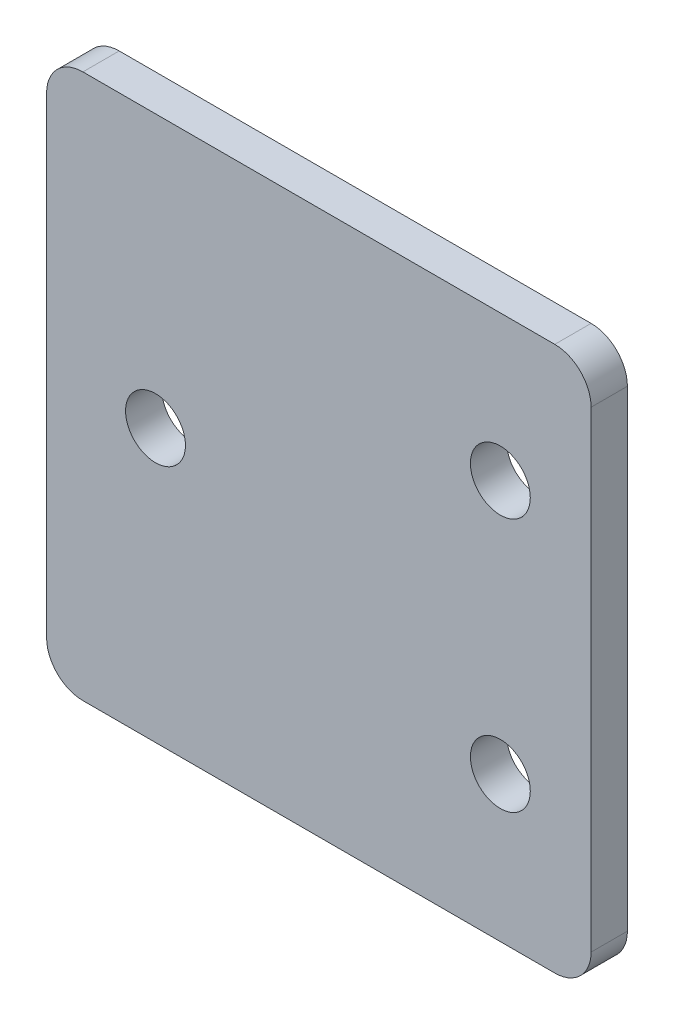
ISO-10303-21;
HEADER;
FILE_DESCRIPTION(('STEP AP214'),'2;1');
FILE_NAME('part.step','',(''),(''),'','','');
FILE_SCHEMA(('AUTOMOTIVE_DESIGN { 1 0 10303 214 1 1 1 1 }'));
ENDSEC;
DATA;
#1=APPLICATION_CONTEXT('core data for automotive mechanical design processes');
#2=APPLICATION_PROTOCOL_DEFINITION('international standard','automotive_design',2000,#1);
#3=PRODUCT_CONTEXT('',#1,'mechanical');
#4=PRODUCT('Part','Part','',(#3));
#5=PRODUCT_RELATED_PRODUCT_CATEGORY('part','',(#4));
#6=PRODUCT_DEFINITION_FORMATION('','',#4);
#7=PRODUCT_DEFINITION_CONTEXT('part definition',#1,'design');
#8=PRODUCT_DEFINITION('design','',#6,#7);
#9=PRODUCT_DEFINITION_SHAPE('','',#8);
#10=(LENGTH_UNIT() NAMED_UNIT(*) SI_UNIT(.MILLI.,.METRE.));
#11=(NAMED_UNIT(*) PLANE_ANGLE_UNIT() SI_UNIT($,.RADIAN.));
#12=(NAMED_UNIT(*) SI_UNIT($,.STERADIAN.) SOLID_ANGLE_UNIT());
#13=UNCERTAINTY_MEASURE_WITH_UNIT(LENGTH_MEASURE(1.E-05),#10,'distance_accuracy_value','');
#14=(GEOMETRIC_REPRESENTATION_CONTEXT(3) GLOBAL_UNCERTAINTY_ASSIGNED_CONTEXT((#13)) GLOBAL_UNIT_ASSIGNED_CONTEXT((#10,
#11,#12)) REPRESENTATION_CONTEXT('',''));
#15=CARTESIAN_POINT('',(0.,0.,0.));
#16=DIRECTION('',(0.,0.,1.));
#17=DIRECTION('',(1.,0.,0.));
#18=AXIS2_PLACEMENT_3D('',#15,#16,#17);
#19=CARTESIAN_POINT('',(0.,0.,0.));
#20=DIRECTION('',(0.,0.,-1.));
#21=DIRECTION('',(-1.,0.,0.));
#22=AXIS2_PLACEMENT_3D('',#19,#20,#21);
#23=PLANE('',#22);
#24=CARTESIAN_POINT('',(-9.,0.,0.));
#25=DIRECTION('',(0.,0.,1.));
#26=DIRECTION('',(1.,0.,0.));
#27=AXIS2_PLACEMENT_3D('',#24,#25,#26);
#28=CIRCLE('',#27,1.65);
#29=CARTESIAN_POINT('',(-7.35,0.,0.));
#30=VERTEX_POINT('',#29);
#31=EDGE_CURVE('E186',#30,#30,#28,.T.);
#32=ORIENTED_EDGE('',*,*,#31,.T.);
#33=EDGE_LOOP('',(#32));
#34=FACE_BOUND('',#33,.T.);
#35=CARTESIAN_POINT('',(10.,7.,0.));
#36=DIRECTION('',(0.,0.,1.));
#37=DIRECTION('',(1.,0.,0.));
#38=AXIS2_PLACEMENT_3D('',#35,#36,#37);
#39=CIRCLE('',#38,1.65);
#40=CARTESIAN_POINT('',(11.65,7.,0.));
#41=VERTEX_POINT('',#40);
#42=EDGE_CURVE('E180',#41,#41,#39,.T.);
#43=ORIENTED_EDGE('',*,*,#42,.T.);
#44=EDGE_LOOP('',(#43));
#45=FACE_BOUND('',#44,.T.);
#46=DIRECTION('',(0.,1.,0.));
#47=VECTOR('',#46,1.);
#48=CARTESIAN_POINT('',(15.,-15.,0.));
#49=LINE('',#48,#47);
#50=CARTESIAN_POINT('',(15.,-13.,0.));
#51=VERTEX_POINT('',#50);
#52=CARTESIAN_POINT('',(15.,13.,0.));
#53=VERTEX_POINT('',#52);
#54=EDGE_CURVE('E116',#51,#53,#49,.T.);
#55=ORIENTED_EDGE('',*,*,#54,.F.);
#56=CARTESIAN_POINT('',(13.,-13.,0.));
#57=DIRECTION('',(0.,0.,-1.));
#58=DIRECTION('',(-1.,0.,0.));
#59=AXIS2_PLACEMENT_3D('',#56,#57,#58);
#60=CIRCLE('',#59,2.);
#61=CARTESIAN_POINT('',(13.,-15.,0.));
#62=VERTEX_POINT('',#61);
#63=EDGE_CURVE('E99',#51,#62,#60,.T.);
#64=ORIENTED_EDGE('',*,*,#63,.T.);
#65=DIRECTION('',(1.,0.,0.));
#66=VECTOR('',#65,1.);
#67=CARTESIAN_POINT('',(-15.,-15.,0.));
#68=LINE('',#67,#66);
#69=CARTESIAN_POINT('',(-13.,-15.,0.));
#70=VERTEX_POINT('',#69);
#71=EDGE_CURVE('E139',#70,#62,#68,.T.);
#72=ORIENTED_EDGE('',*,*,#71,.F.);
#73=CARTESIAN_POINT('',(-13.,-13.,0.));
#74=DIRECTION('',(0.,0.,-1.));
#75=DIRECTION('',(-1.,0.,0.));
#76=AXIS2_PLACEMENT_3D('',#73,#74,#75);
#77=CIRCLE('',#76,2.);
#78=CARTESIAN_POINT('',(-15.,-13.,0.));
#79=VERTEX_POINT('',#78);
#80=EDGE_CURVE('E143',#70,#79,#77,.T.);
#81=ORIENTED_EDGE('',*,*,#80,.T.);
#82=DIRECTION('',(0.,-1.,0.));
#83=VECTOR('',#82,1.);
#84=CARTESIAN_POINT('',(-15.,-15.,0.));
#85=LINE('',#84,#83);
#86=CARTESIAN_POINT('',(-15.,13.,0.));
#87=VERTEX_POINT('',#86);
#88=EDGE_CURVE('E129',#87,#79,#85,.T.);
#89=ORIENTED_EDGE('',*,*,#88,.F.);
#90=CARTESIAN_POINT('',(-13.,13.,0.));
#91=DIRECTION('',(0.,0.,-1.));
#92=DIRECTION('',(-1.,0.,0.));
#93=AXIS2_PLACEMENT_3D('',#90,#91,#92);
#94=CIRCLE('',#93,2.);
#95=CARTESIAN_POINT('',(-13.,15.,0.));
#96=VERTEX_POINT('',#95);
#97=EDGE_CURVE('E120',#87,#96,#94,.T.);
#98=ORIENTED_EDGE('',*,*,#97,.T.);
#99=DIRECTION('',(-1.,0.,0.));
#100=VECTOR('',#99,1.);
#101=CARTESIAN_POINT('',(-15.,15.,0.));
#102=LINE('',#101,#100);
#103=CARTESIAN_POINT('',(13.,15.,0.));
#104=VERTEX_POINT('',#103);
#105=EDGE_CURVE('E125',#104,#96,#102,.T.);
#106=ORIENTED_EDGE('',*,*,#105,.F.);
#107=CARTESIAN_POINT('',(13.,13.,0.));
#108=DIRECTION('',(0.,0.,-1.));
#109=DIRECTION('',(-1.,0.,0.));
#110=AXIS2_PLACEMENT_3D('',#107,#108,#109);
#111=CIRCLE('',#110,2.);
#112=EDGE_CURVE('E110',#104,#53,#111,.T.);
#113=ORIENTED_EDGE('',*,*,#112,.T.);
#114=EDGE_LOOP('',(#55,#64,#72,#81,#89,#98,#106,#113));
#115=FACE_BOUND('',#114,.T.);
#116=CARTESIAN_POINT('',(10.,-7.,0.));
#117=DIRECTION('',(0.,0.,1.));
#118=DIRECTION('',(1.,0.,0.));
#119=AXIS2_PLACEMENT_3D('',#116,#117,#118);
#120=CIRCLE('',#119,1.65);
#121=CARTESIAN_POINT('',(11.65,-7.,0.));
#122=VERTEX_POINT('',#121);
#123=EDGE_CURVE('E126',#122,#122,#120,.T.);
#124=ORIENTED_EDGE('',*,*,#123,.T.);
#125=EDGE_LOOP('',(#124));
#126=FACE_BOUND('',#125,.T.);
#127=ADVANCED_FACE('F34',(#34,#45,#115,#126),#23,.T.);
#128=CARTESIAN_POINT('',(15.,-15.,2.));
#129=DIRECTION('',(-1.,0.,0.));
#130=DIRECTION('',(0.,0.,1.));
#131=AXIS2_PLACEMENT_3D('',#128,#129,#130);
#132=PLANE('',#131);
#133=DIRECTION('',(0.,1.,0.));
#134=VECTOR('',#133,1.);
#135=CARTESIAN_POINT('',(15.,-15.,2.));
#136=LINE('',#135,#134);
#137=CARTESIAN_POINT('',(15.,-13.,2.));
#138=VERTEX_POINT('',#137);
#139=CARTESIAN_POINT('',(15.,13.,2.));
#140=VERTEX_POINT('',#139);
#141=EDGE_CURVE('E119',#138,#140,#136,.T.);
#142=ORIENTED_EDGE('',*,*,#141,.F.);
#143=DIRECTION('',(0.,0.,-1.));
#144=VECTOR('',#143,1.);
#145=CARTESIAN_POINT('',(15.,-13.,2.));
#146=LINE('',#145,#144);
#147=EDGE_CURVE('E103',#138,#51,#146,.T.);
#148=ORIENTED_EDGE('',*,*,#147,.T.);
#149=ORIENTED_EDGE('',*,*,#54,.T.);
#150=DIRECTION('',(0.,0.,-1.));
#151=VECTOR('',#150,1.);
#152=CARTESIAN_POINT('',(15.,13.,2.));
#153=LINE('',#152,#151);
#154=EDGE_CURVE('E121',#53,#140,#153,.F.);
#155=ORIENTED_EDGE('',*,*,#154,.T.);
#156=EDGE_LOOP('',(#142,#148,#149,#155));
#157=FACE_BOUND('',#156,.T.);
#158=ADVANCED_FACE('F115',(#157),#132,.F.);
#159=CARTESIAN_POINT('',(-15.,15.,2.));
#160=DIRECTION('',(0.,-1.,0.));
#161=DIRECTION('',(0.,0.,-1.));
#162=AXIS2_PLACEMENT_3D('',#159,#160,#161);
#163=PLANE('',#162);
#164=DIRECTION('',(-1.,0.,0.));
#165=VECTOR('',#164,1.);
#166=CARTESIAN_POINT('',(-15.,15.,2.));
#167=LINE('',#166,#165);
#168=CARTESIAN_POINT('',(13.,15.,2.));
#169=VERTEX_POINT('',#168);
#170=CARTESIAN_POINT('',(-13.,15.,2.));
#171=VERTEX_POINT('',#170);
#172=EDGE_CURVE('E174',#169,#171,#167,.T.);
#173=ORIENTED_EDGE('',*,*,#172,.F.);
#174=DIRECTION('',(0.,0.,-1.));
#175=VECTOR('',#174,1.);
#176=CARTESIAN_POINT('',(13.,15.,2.));
#177=LINE('',#176,#175);
#178=EDGE_CURVE('E158',#169,#104,#177,.T.);
#179=ORIENTED_EDGE('',*,*,#178,.T.);
#180=ORIENTED_EDGE('',*,*,#105,.T.);
#181=DIRECTION('',(0.,0.,-1.));
#182=VECTOR('',#181,1.);
#183=CARTESIAN_POINT('',(-13.,15.,2.));
#184=LINE('',#183,#182);
#185=EDGE_CURVE('E156',#96,#171,#184,.F.);
#186=ORIENTED_EDGE('',*,*,#185,.T.);
#187=EDGE_LOOP('',(#173,#179,#180,#186));
#188=FACE_BOUND('',#187,.T.);
#189=ADVANCED_FACE('F221',(#188),#163,.F.);
#190=CARTESIAN_POINT('',(-15.,-15.,2.));
#191=DIRECTION('',(1.,0.,0.));
#192=DIRECTION('',(0.,0.,-1.));
#193=AXIS2_PLACEMENT_3D('',#190,#191,#192);
#194=PLANE('',#193);
#195=ORIENTED_EDGE('',*,*,#88,.T.);
#196=DIRECTION('',(0.,0.,-1.));
#197=VECTOR('',#196,1.);
#198=CARTESIAN_POINT('',(-15.,-13.,2.));
#199=LINE('',#198,#197);
#200=CARTESIAN_POINT('',(-15.,-13.,2.));
#201=VERTEX_POINT('',#200);
#202=EDGE_CURVE('E11',#79,#201,#199,.F.);
#203=ORIENTED_EDGE('',*,*,#202,.T.);
#204=DIRECTION('',(0.,-1.,0.));
#205=VECTOR('',#204,1.);
#206=CARTESIAN_POINT('',(-15.,-15.,2.));
#207=LINE('',#206,#205);
#208=CARTESIAN_POINT('',(-15.,13.,2.));
#209=VERTEX_POINT('',#208);
#210=EDGE_CURVE('E164',#209,#201,#207,.T.);
#211=ORIENTED_EDGE('',*,*,#210,.F.);
#212=DIRECTION('',(0.,0.,-1.));
#213=VECTOR('',#212,1.);
#214=CARTESIAN_POINT('',(-15.,13.,2.));
#215=LINE('',#214,#213);
#216=EDGE_CURVE('E42',#209,#87,#215,.T.);
#217=ORIENTED_EDGE('',*,*,#216,.T.);
#218=EDGE_LOOP('',(#195,#203,#211,#217));
#219=FACE_BOUND('',#218,.T.);
#220=ADVANCED_FACE('F163',(#219),#194,.F.);
#221=CARTESIAN_POINT('',(-15.,-15.,2.));
#222=DIRECTION('',(0.,1.,0.));
#223=DIRECTION('',(0.,0.,1.));
#224=AXIS2_PLACEMENT_3D('',#221,#222,#223);
#225=PLANE('',#224);
#226=ORIENTED_EDGE('',*,*,#71,.T.);
#227=DIRECTION('',(0.,0.,-1.));
#228=VECTOR('',#227,1.);
#229=CARTESIAN_POINT('',(13.,-15.,2.));
#230=LINE('',#229,#228);
#231=CARTESIAN_POINT('',(13.,-15.,2.));
#232=VERTEX_POINT('',#231);
#233=EDGE_CURVE('E104',#62,#232,#230,.F.);
#234=ORIENTED_EDGE('',*,*,#233,.T.);
#235=DIRECTION('',(1.,0.,0.));
#236=VECTOR('',#235,1.);
#237=CARTESIAN_POINT('',(-15.,-15.,2.));
#238=LINE('',#237,#236);
#239=CARTESIAN_POINT('',(-13.,-15.,2.));
#240=VERTEX_POINT('',#239);
#241=EDGE_CURVE('E135',#240,#232,#238,.T.);
#242=ORIENTED_EDGE('',*,*,#241,.F.);
#243=DIRECTION('',(0.,0.,-1.));
#244=VECTOR('',#243,1.);
#245=CARTESIAN_POINT('',(-13.,-15.,2.));
#246=LINE('',#245,#244);
#247=EDGE_CURVE('E109',#240,#70,#246,.T.);
#248=ORIENTED_EDGE('',*,*,#247,.T.);
#249=EDGE_LOOP('',(#226,#234,#242,#248));
#250=FACE_BOUND('',#249,.T.);
#251=ADVANCED_FACE('F172',(#250),#225,.F.);
#252=CARTESIAN_POINT('',(0.,0.,2.));
#253=DIRECTION('',(0.,0.,-1.));
#254=DIRECTION('',(-1.,0.,0.));
#255=AXIS2_PLACEMENT_3D('',#252,#253,#254);
#256=PLANE('',#255);
#257=CARTESIAN_POINT('',(-9.,0.,2.));
#258=DIRECTION('',(0.,0.,1.));
#259=DIRECTION('',(1.,0.,0.));
#260=AXIS2_PLACEMENT_3D('',#257,#258,#259);
#261=CIRCLE('',#260,1.65);
#262=CARTESIAN_POINT('',(-7.35,0.,2.));
#263=VERTEX_POINT('',#262);
#264=EDGE_CURVE('E189',#263,#263,#261,.T.);
#265=ORIENTED_EDGE('',*,*,#264,.F.);
#266=EDGE_LOOP('',(#265));
#267=FACE_BOUND('',#266,.T.);
#268=CARTESIAN_POINT('',(10.,7.,2.));
#269=DIRECTION('',(0.,0.,1.));
#270=DIRECTION('',(1.,0.,0.));
#271=AXIS2_PLACEMENT_3D('',#268,#269,#270);
#272=CIRCLE('',#271,1.65);
#273=CARTESIAN_POINT('',(11.65,7.,2.));
#274=VERTEX_POINT('',#273);
#275=EDGE_CURVE('E183',#274,#274,#272,.T.);
#276=ORIENTED_EDGE('',*,*,#275,.F.);
#277=EDGE_LOOP('',(#276));
#278=FACE_BOUND('',#277,.T.);
#279=CARTESIAN_POINT('',(10.,-7.,2.));
#280=DIRECTION('',(0.,0.,1.));
#281=DIRECTION('',(1.,0.,0.));
#282=AXIS2_PLACEMENT_3D('',#279,#280,#281);
#283=CIRCLE('',#282,1.65);
#284=CARTESIAN_POINT('',(11.65,-7.,2.));
#285=VERTEX_POINT('',#284);
#286=EDGE_CURVE('E132',#285,#285,#283,.T.);
#287=ORIENTED_EDGE('',*,*,#286,.F.);
#288=EDGE_LOOP('',(#287));
#289=FACE_BOUND('',#288,.T.);
#290=ORIENTED_EDGE('',*,*,#241,.T.);
#291=CARTESIAN_POINT('',(13.,-13.,2.));
#292=DIRECTION('',(0.,0.,-1.));
#293=DIRECTION('',(-1.,0.,0.));
#294=AXIS2_PLACEMENT_3D('',#291,#292,#293);
#295=CIRCLE('',#294,2.);
#296=EDGE_CURVE('E154',#232,#138,#295,.F.);
#297=ORIENTED_EDGE('',*,*,#296,.T.);
#298=ORIENTED_EDGE('',*,*,#141,.T.);
#299=CARTESIAN_POINT('',(13.,13.,2.));
#300=DIRECTION('',(0.,0.,-1.));
#301=DIRECTION('',(-1.,0.,0.));
#302=AXIS2_PLACEMENT_3D('',#299,#300,#301);
#303=CIRCLE('',#302,2.);
#304=EDGE_CURVE('E152',#140,#169,#303,.F.);
#305=ORIENTED_EDGE('',*,*,#304,.T.);
#306=ORIENTED_EDGE('',*,*,#172,.T.);
#307=CARTESIAN_POINT('',(-13.,13.,2.));
#308=DIRECTION('',(0.,0.,-1.));
#309=DIRECTION('',(-1.,0.,0.));
#310=AXIS2_PLACEMENT_3D('',#307,#308,#309);
#311=CIRCLE('',#310,2.);
#312=EDGE_CURVE('E54',#171,#209,#311,.F.);
#313=ORIENTED_EDGE('',*,*,#312,.T.);
#314=ORIENTED_EDGE('',*,*,#210,.T.);
#315=CARTESIAN_POINT('',(-13.,-13.,2.));
#316=DIRECTION('',(0.,0.,-1.));
#317=DIRECTION('',(-1.,0.,0.));
#318=AXIS2_PLACEMENT_3D('',#315,#316,#317);
#319=CIRCLE('',#318,2.);
#320=EDGE_CURVE('E150',#201,#240,#319,.F.);
#321=ORIENTED_EDGE('',*,*,#320,.T.);
#322=EDGE_LOOP('',(#290,#297,#298,#305,#306,#313,#314,#321));
#323=FACE_BOUND('',#322,.T.);
#324=ADVANCED_FACE('F195',(#267,#278,#289,#323),#256,.F.);
#325=CARTESIAN_POINT('',(13.,-13.,2.));
#326=DIRECTION('',(0.,0.,-1.));
#327=DIRECTION('',(-1.,0.,0.));
#328=AXIS2_PLACEMENT_3D('',#325,#326,#327);
#329=CYLINDRICAL_SURFACE('',#328,2.);
#330=ORIENTED_EDGE('',*,*,#296,.F.);
#331=ORIENTED_EDGE('',*,*,#233,.F.);
#332=ORIENTED_EDGE('',*,*,#63,.F.);
#333=ORIENTED_EDGE('',*,*,#147,.F.);
#334=EDGE_LOOP('',(#330,#331,#332,#333));
#335=FACE_BOUND('',#334,.T.);
#336=ADVANCED_FACE('F102',(#335),#329,.T.);
#337=CARTESIAN_POINT('',(13.,13.,2.));
#338=DIRECTION('',(0.,0.,-1.));
#339=DIRECTION('',(-1.,0.,0.));
#340=AXIS2_PLACEMENT_3D('',#337,#338,#339);
#341=CYLINDRICAL_SURFACE('',#340,2.);
#342=ORIENTED_EDGE('',*,*,#304,.F.);
#343=ORIENTED_EDGE('',*,*,#154,.F.);
#344=ORIENTED_EDGE('',*,*,#112,.F.);
#345=ORIENTED_EDGE('',*,*,#178,.F.);
#346=EDGE_LOOP('',(#342,#343,#344,#345));
#347=FACE_BOUND('',#346,.T.);
#348=ADVANCED_FACE('F234',(#347),#341,.T.);
#349=CARTESIAN_POINT('',(-13.,-13.,2.));
#350=DIRECTION('',(0.,0.,-1.));
#351=DIRECTION('',(-1.,0.,0.));
#352=AXIS2_PLACEMENT_3D('',#349,#350,#351);
#353=CYLINDRICAL_SURFACE('',#352,2.);
#354=ORIENTED_EDGE('',*,*,#320,.F.);
#355=ORIENTED_EDGE('',*,*,#202,.F.);
#356=ORIENTED_EDGE('',*,*,#80,.F.);
#357=ORIENTED_EDGE('',*,*,#247,.F.);
#358=EDGE_LOOP('',(#354,#355,#356,#357));
#359=FACE_BOUND('',#358,.T.);
#360=ADVANCED_FACE('F169',(#359),#353,.T.);
#361=CARTESIAN_POINT('',(-13.,13.,2.));
#362=DIRECTION('',(0.,0.,-1.));
#363=DIRECTION('',(-1.,0.,0.));
#364=AXIS2_PLACEMENT_3D('',#361,#362,#363);
#365=CYLINDRICAL_SURFACE('',#364,2.);
#366=ORIENTED_EDGE('',*,*,#312,.F.);
#367=ORIENTED_EDGE('',*,*,#185,.F.);
#368=ORIENTED_EDGE('',*,*,#97,.F.);
#369=ORIENTED_EDGE('',*,*,#216,.F.);
#370=EDGE_LOOP('',(#366,#367,#368,#369));
#371=FACE_BOUND('',#370,.T.);
#372=ADVANCED_FACE('F36',(#371),#365,.T.);
#373=CARTESIAN_POINT('',(10.,-7.,2.));
#374=DIRECTION('',(0.,0.,1.));
#375=DIRECTION('',(1.,0.,0.));
#376=AXIS2_PLACEMENT_3D('',#373,#374,#375);
#377=CYLINDRICAL_SURFACE('',#376,1.65);
#378=ORIENTED_EDGE('',*,*,#123,.F.);
#379=EDGE_LOOP('',(#378));
#380=FACE_BOUND('',#379,.T.);
#381=ORIENTED_EDGE('',*,*,#286,.T.);
#382=EDGE_LOOP('',(#381));
#383=FACE_BOUND('',#382,.T.);
#384=ADVANCED_FACE('F203',(#380,#383),#377,.F.);
#385=CARTESIAN_POINT('',(10.,7.,2.));
#386=DIRECTION('',(0.,0.,1.));
#387=DIRECTION('',(1.,0.,0.));
#388=AXIS2_PLACEMENT_3D('',#385,#386,#387);
#389=CYLINDRICAL_SURFACE('',#388,1.65);
#390=ORIENTED_EDGE('',*,*,#42,.F.);
#391=EDGE_LOOP('',(#390));
#392=FACE_BOUND('',#391,.T.);
#393=ORIENTED_EDGE('',*,*,#275,.T.);
#394=EDGE_LOOP('',(#393));
#395=FACE_BOUND('',#394,.T.);
#396=ADVANCED_FACE('F205',(#392,#395),#389,.F.);
#397=CARTESIAN_POINT('',(-9.,0.,2.));
#398=DIRECTION('',(0.,0.,1.));
#399=DIRECTION('',(1.,0.,0.));
#400=AXIS2_PLACEMENT_3D('',#397,#398,#399);
#401=CYLINDRICAL_SURFACE('',#400,1.65);
#402=ORIENTED_EDGE('',*,*,#31,.F.);
#403=EDGE_LOOP('',(#402));
#404=FACE_BOUND('',#403,.T.);
#405=ORIENTED_EDGE('',*,*,#264,.T.);
#406=EDGE_LOOP('',(#405));
#407=FACE_BOUND('',#406,.T.);
#408=ADVANCED_FACE('F193',(#404,#407),#401,.F.);
#409=CLOSED_SHELL('',(#127,#158,#189,#220,#251,#324,#336,#348,#360,#372,#384,#396,#408));
#410=MANIFOLD_SOLID_BREP('B2',#409);
#411=ADVANCED_BREP_SHAPE_REPRESENTATION('',(#18,#410),#14);
#412=SHAPE_DEFINITION_REPRESENTATION(#9,#411);
ENDSEC;
END-ISO-10303-21;
